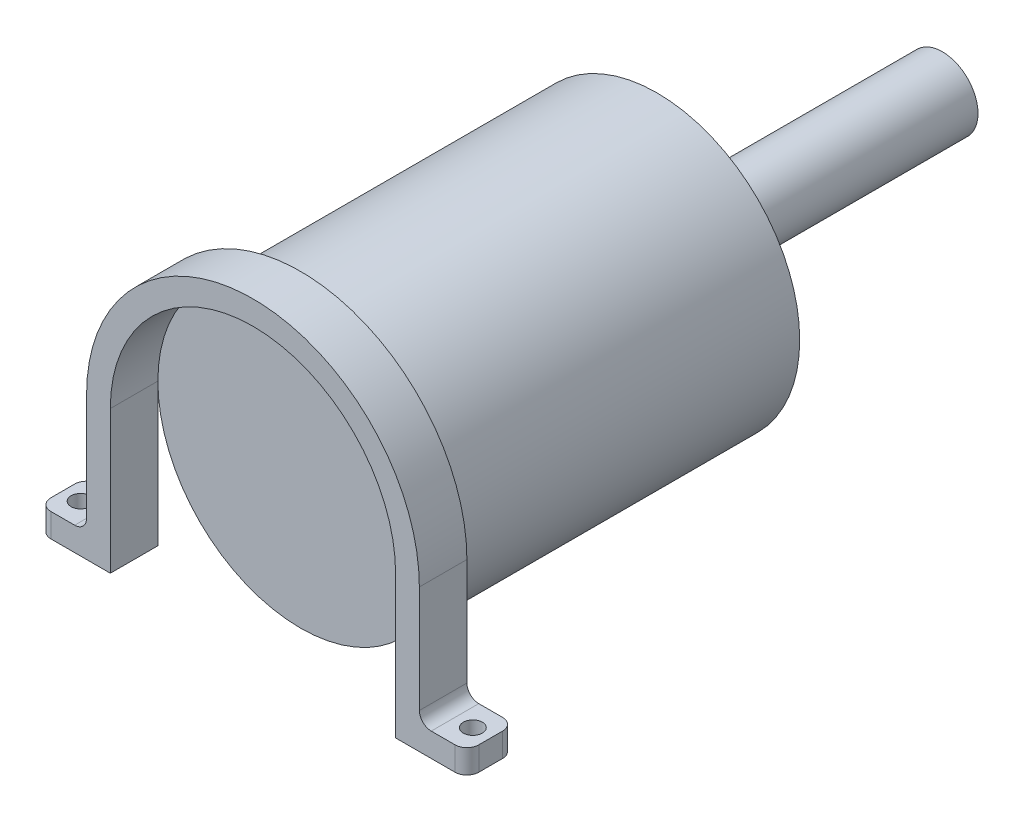
ISO-10303-21;
HEADER;
FILE_DESCRIPTION(('STEP AP214'),'2;1');
FILE_NAME('part.step','',(''),(''),'','','');
FILE_SCHEMA(('AUTOMOTIVE_DESIGN { 1 0 10303 214 1 1 1 1 }'));
ENDSEC;
DATA;
#1=APPLICATION_CONTEXT('core data for automotive mechanical design processes');
#2=APPLICATION_PROTOCOL_DEFINITION('international standard','automotive_design',2000,#1);
#3=PRODUCT_CONTEXT('',#1,'mechanical');
#4=PRODUCT('Part','Part','',(#3));
#5=PRODUCT_RELATED_PRODUCT_CATEGORY('part','',(#4));
#6=PRODUCT_DEFINITION_FORMATION('','',#4);
#7=PRODUCT_DEFINITION_CONTEXT('part definition',#1,'design');
#8=PRODUCT_DEFINITION('design','',#6,#7);
#9=PRODUCT_DEFINITION_SHAPE('','',#8);
#10=(LENGTH_UNIT() NAMED_UNIT(*) SI_UNIT(.MILLI.,.METRE.));
#11=(NAMED_UNIT(*) PLANE_ANGLE_UNIT() SI_UNIT($,.RADIAN.));
#12=(NAMED_UNIT(*) SI_UNIT($,.STERADIAN.) SOLID_ANGLE_UNIT());
#13=UNCERTAINTY_MEASURE_WITH_UNIT(LENGTH_MEASURE(1.E-05),#10,'distance_accuracy_value','');
#14=(GEOMETRIC_REPRESENTATION_CONTEXT(3) GLOBAL_UNCERTAINTY_ASSIGNED_CONTEXT((#13)) GLOBAL_UNIT_ASSIGNED_CONTEXT((#10,
#11,#12)) REPRESENTATION_CONTEXT('',''));
#15=CARTESIAN_POINT('',(0.,0.,0.));
#16=DIRECTION('',(0.,0.,1.));
#17=DIRECTION('',(1.,0.,0.));
#18=AXIS2_PLACEMENT_3D('',#15,#16,#17);
#19=CARTESIAN_POINT('',(899.999999999991,-500.000000000387,2900.));
#20=DIRECTION('',(-1.,0.,0.));
#21=DIRECTION('',(0.,0.,1.));
#22=AXIS2_PLACEMENT_3D('',#19,#20,#21);
#23=PLANE('',#22);
#24=DIRECTION('',(0.,0.,-1.));
#25=VECTOR('',#24,1.);
#26=CARTESIAN_POINT('',(899.999999999991,-600.000000000387,2900.));
#27=LINE('',#26,#25);
#28=CARTESIAN_POINT('',(899.999999999991,-600.000000000387,2850.));
#29=VERTEX_POINT('',#28);
#30=CARTESIAN_POINT('',(899.999999999991,-600.000000000387,2750.));
#31=VERTEX_POINT('',#30);
#32=EDGE_CURVE('E222',#29,#31,#27,.T.);
#33=ORIENTED_EDGE('',*,*,#32,.T.);
#34=DIRECTION('',(0.,1.,0.));
#35=VECTOR('',#34,1.);
#36=CARTESIAN_POINT('',(899.999999999991,-500.000000000387,2750.));
#37=LINE('',#36,#35);
#38=CARTESIAN_POINT('',(899.999999999991,-500.000000000387,2750.));
#39=VERTEX_POINT('',#38);
#40=EDGE_CURVE('E282',#31,#39,#37,.T.);
#41=ORIENTED_EDGE('',*,*,#40,.T.);
#42=DIRECTION('',(0.,0.,-1.));
#43=VECTOR('',#42,1.);
#44=CARTESIAN_POINT('',(899.999999999991,-500.000000000387,2900.));
#45=LINE('',#44,#43);
#46=CARTESIAN_POINT('',(899.999999999991,-500.000000000387,2850.));
#47=VERTEX_POINT('',#46);
#48=EDGE_CURVE('E192',#47,#39,#45,.T.);
#49=ORIENTED_EDGE('',*,*,#48,.F.);
#50=DIRECTION('',(0.,1.,0.));
#51=VECTOR('',#50,1.);
#52=CARTESIAN_POINT('',(899.999999999991,-600.000000000387,2850.));
#53=LINE('',#52,#51);
#54=EDGE_CURVE('E280',#47,#29,#53,.F.);
#55=ORIENTED_EDGE('',*,*,#54,.T.);
#56=EDGE_LOOP('',(#33,#41,#49,#55));
#57=FACE_BOUND('',#56,.T.);
#58=ADVANCED_FACE('F47',(#57),#23,.F.);
#59=CARTESIAN_POINT('',(750.,-500.000000000387,2900.));
#60=DIRECTION('',(0.,-1.,0.));
#61=DIRECTION('',(0.,0.,-1.));
#62=AXIS2_PLACEMENT_3D('',#59,#60,#61);
#63=PLANE('',#62);
#64=CARTESIAN_POINT('',(825.000000000005,-500.000000000387,2800.));
#65=DIRECTION('',(0.,-1.,0.));
#66=DIRECTION('',(0.,0.,1.));
#67=AXIS2_PLACEMENT_3D('',#64,#65,#66);
#68=CIRCLE('',#67,40.);
#69=CARTESIAN_POINT('',(825.000000000005,-500.000000000387,2840.));
#70=VERTEX_POINT('',#69);
#71=EDGE_CURVE('E567',#70,#70,#68,.T.);
#72=ORIENTED_EDGE('',*,*,#71,.T.);
#73=EDGE_LOOP('',(#72));
#74=FACE_BOUND('',#73,.T.);
#75=ORIENTED_EDGE('',*,*,#48,.T.);
#76=CARTESIAN_POINT('',(849.999999999991,-500.000000000387,2750.));
#77=DIRECTION('',(0.,-1.,0.));
#78=DIRECTION('',(0.,0.,-1.));
#79=AXIS2_PLACEMENT_3D('',#76,#77,#78);
#80=CIRCLE('',#79,50.);
#81=CARTESIAN_POINT('',(849.999999999991,-500.000000000387,2700.));
#82=VERTEX_POINT('',#81);
#83=EDGE_CURVE('E287',#39,#82,#80,.F.);
#84=ORIENTED_EDGE('',*,*,#83,.T.);
#85=DIRECTION('',(-1.,0.,0.));
#86=VECTOR('',#85,1.);
#87=CARTESIAN_POINT('',(750.,-500.000000000387,2700.));
#88=LINE('',#87,#86);
#89=CARTESIAN_POINT('',(750.,-500.000000000387,2700.));
#90=VERTEX_POINT('',#89);
#91=EDGE_CURVE('E189',#82,#90,#88,.T.);
#92=ORIENTED_EDGE('',*,*,#91,.T.);
#93=DIRECTION('',(0.,0.,-1.));
#94=VECTOR('',#93,1.);
#95=CARTESIAN_POINT('',(750.,-500.000000000387,2900.));
#96=LINE('',#95,#94);
#97=CARTESIAN_POINT('',(750.,-500.000000000387,2900.));
#98=VERTEX_POINT('',#97);
#99=EDGE_CURVE('E185',#98,#90,#96,.T.);
#100=ORIENTED_EDGE('',*,*,#99,.F.);
#101=DIRECTION('',(-1.,0.,0.));
#102=VECTOR('',#101,1.);
#103=CARTESIAN_POINT('',(750.,-500.000000000387,2900.));
#104=LINE('',#103,#102);
#105=CARTESIAN_POINT('',(849.999999999991,-500.000000000387,2900.));
#106=VERTEX_POINT('',#105);
#107=EDGE_CURVE('E172',#106,#98,#104,.T.);
#108=ORIENTED_EDGE('',*,*,#107,.F.);
#109=CARTESIAN_POINT('',(849.999999999991,-500.000000000387,2850.));
#110=DIRECTION('',(0.,-1.,0.));
#111=DIRECTION('',(0.,0.,-1.));
#112=AXIS2_PLACEMENT_3D('',#109,#110,#111);
#113=CIRCLE('',#112,50.);
#114=EDGE_CURVE('E285',#106,#47,#113,.F.);
#115=ORIENTED_EDGE('',*,*,#114,.T.);
#116=EDGE_LOOP('',(#75,#84,#92,#100,#108,#115));
#117=FACE_BOUND('',#116,.T.);
#118=ADVANCED_FACE('F187',(#74,#117),#63,.F.);
#119=CARTESIAN_POINT('',(750.,-450.000000000387,2900.));
#120=DIRECTION('',(0.,0.,-1.));
#121=DIRECTION('',(-1.,0.,0.));
#122=AXIS2_PLACEMENT_3D('',#119,#120,#121);
#123=CYLINDRICAL_SURFACE('',#122,50.);
#124=CARTESIAN_POINT('',(750.,-450.000000000387,2700.));
#125=DIRECTION('',(0.,0.,-1.));
#126=DIRECTION('',(-1.,0.,0.));
#127=AXIS2_PLACEMENT_3D('',#124,#125,#126);
#128=CIRCLE('',#127,50.);
#129=CARTESIAN_POINT('',(700.,-450.000000000387,2700.));
#130=VERTEX_POINT('',#129);
#131=EDGE_CURVE('E224',#90,#130,#128,.T.);
#132=ORIENTED_EDGE('',*,*,#131,.T.);
#133=DIRECTION('',(0.,0.,-1.));
#134=VECTOR('',#133,1.);
#135=CARTESIAN_POINT('',(700.,-450.000000000387,2900.));
#136=LINE('',#135,#134);
#137=CARTESIAN_POINT('',(700.,-450.000000000387,2900.));
#138=VERTEX_POINT('',#137);
#139=EDGE_CURVE('E193',#138,#130,#136,.T.);
#140=ORIENTED_EDGE('',*,*,#139,.F.);
#141=CARTESIAN_POINT('',(750.,-450.000000000387,2900.));
#142=DIRECTION('',(0.,0.,-1.));
#143=DIRECTION('',(-1.,0.,0.));
#144=AXIS2_PLACEMENT_3D('',#141,#142,#143);
#145=CIRCLE('',#144,50.);
#146=EDGE_CURVE('E177',#98,#138,#145,.T.);
#147=ORIENTED_EDGE('',*,*,#146,.F.);
#148=ORIENTED_EDGE('',*,*,#99,.T.);
#149=EDGE_LOOP('',(#132,#140,#147,#148));
#150=FACE_BOUND('',#149,.T.);
#151=ADVANCED_FACE('F195',(#150),#123,.F.);
#152=CARTESIAN_POINT('',(700.,2.21802997291814E-13,2900.));
#153=DIRECTION('',(-1.,0.,0.));
#154=DIRECTION('',(0.,0.,1.));
#155=AXIS2_PLACEMENT_3D('',#152,#153,#154);
#156=PLANE('',#155);
#157=DIRECTION('',(0.,1.,0.));
#158=VECTOR('',#157,1.);
#159=CARTESIAN_POINT('',(700.,2.21802997291814E-13,2700.));
#160=LINE('',#159,#158);
#161=CARTESIAN_POINT('',(700.,2.21802997291814E-13,2700.));
#162=VERTEX_POINT('',#161);
#163=EDGE_CURVE('E227',#130,#162,#160,.T.);
#164=ORIENTED_EDGE('',*,*,#163,.T.);
#165=DIRECTION('',(0.,0.,-1.));
#166=VECTOR('',#165,1.);
#167=CARTESIAN_POINT('',(700.,2.21802997291814E-13,2900.));
#168=LINE('',#167,#166);
#169=CARTESIAN_POINT('',(700.,2.21802997291814E-13,2900.));
#170=VERTEX_POINT('',#169);
#171=EDGE_CURVE('E275',#170,#162,#168,.T.);
#172=ORIENTED_EDGE('',*,*,#171,.F.);
#173=DIRECTION('',(0.,1.,0.));
#174=VECTOR('',#173,1.);
#175=CARTESIAN_POINT('',(700.,2.21802997291814E-13,2900.));
#176=LINE('',#175,#174);
#177=EDGE_CURVE('E198',#138,#170,#176,.T.);
#178=ORIENTED_EDGE('',*,*,#177,.F.);
#179=ORIENTED_EDGE('',*,*,#139,.T.);
#180=EDGE_LOOP('',(#164,#172,#178,#179));
#181=FACE_BOUND('',#180,.T.);
#182=ADVANCED_FACE('F362',(#181),#156,.F.);
#183=CARTESIAN_POINT('',(0.,0.,2900.));
#184=DIRECTION('',(0.,0.,-1.));
#185=DIRECTION('',(-1.,0.,0.));
#186=AXIS2_PLACEMENT_3D('',#183,#184,#185);
#187=CYLINDRICAL_SURFACE('',#186,700.);
#188=CARTESIAN_POINT('',(0.,0.,2700.));
#189=DIRECTION('',(0.,0.,1.));
#190=DIRECTION('',(1.,0.,0.));
#191=AXIS2_PLACEMENT_3D('',#188,#189,#190);
#192=CIRCLE('',#191,700.);
#193=CARTESIAN_POINT('',(-700.,-2.25137170954729E-13,2700.));
#194=VERTEX_POINT('',#193);
#195=EDGE_CURVE('E229',#162,#194,#192,.T.);
#196=ORIENTED_EDGE('',*,*,#195,.T.);
#197=DIRECTION('',(0.,0.,-1.));
#198=VECTOR('',#197,1.);
#199=CARTESIAN_POINT('',(-700.,-2.25137170954729E-13,2900.));
#200=LINE('',#199,#198);
#201=CARTESIAN_POINT('',(-700.,-2.25137170954729E-13,2900.));
#202=VERTEX_POINT('',#201);
#203=EDGE_CURVE('E272',#202,#194,#200,.T.);
#204=ORIENTED_EDGE('',*,*,#203,.F.);
#205=CARTESIAN_POINT('',(0.,0.,2900.));
#206=DIRECTION('',(0.,0.,1.));
#207=DIRECTION('',(1.,0.,0.));
#208=AXIS2_PLACEMENT_3D('',#205,#206,#207);
#209=CIRCLE('',#208,700.);
#210=EDGE_CURVE('E200',#170,#202,#209,.T.);
#211=ORIENTED_EDGE('',*,*,#210,.F.);
#212=ORIENTED_EDGE('',*,*,#171,.T.);
#213=EDGE_LOOP('',(#196,#204,#211,#212));
#214=FACE_BOUND('',#213,.T.);
#215=ADVANCED_FACE('F369',(#214),#187,.T.);
#216=CARTESIAN_POINT('',(-700.,-2.25137170954729E-13,2900.));
#217=DIRECTION('',(1.,0.,0.));
#218=DIRECTION('',(0.,1.,0.));
#219=AXIS2_PLACEMENT_3D('',#216,#217,#218);
#220=PLANE('',#219);
#221=DIRECTION('',(0.,-1.,0.));
#222=VECTOR('',#221,1.);
#223=CARTESIAN_POINT('',(-700.,-2.25137170954729E-13,2700.));
#224=LINE('',#223,#222);
#225=CARTESIAN_POINT('',(-700.,-450.000000000387,2700.));
#226=VERTEX_POINT('',#225);
#227=EDGE_CURVE('E231',#194,#226,#224,.T.);
#228=ORIENTED_EDGE('',*,*,#227,.T.);
#229=DIRECTION('',(0.,0.,-1.));
#230=VECTOR('',#229,1.);
#231=CARTESIAN_POINT('',(-700.,-450.000000000387,2900.));
#232=LINE('',#231,#230);
#233=CARTESIAN_POINT('',(-700.,-450.000000000387,2900.));
#234=VERTEX_POINT('',#233);
#235=EDGE_CURVE('E269',#234,#226,#232,.T.);
#236=ORIENTED_EDGE('',*,*,#235,.F.);
#237=DIRECTION('',(0.,-1.,0.));
#238=VECTOR('',#237,1.);
#239=CARTESIAN_POINT('',(-700.,-2.25137170954729E-13,2900.));
#240=LINE('',#239,#238);
#241=EDGE_CURVE('E205',#202,#234,#240,.T.);
#242=ORIENTED_EDGE('',*,*,#241,.F.);
#243=ORIENTED_EDGE('',*,*,#203,.T.);
#244=EDGE_LOOP('',(#228,#236,#242,#243));
#245=FACE_BOUND('',#244,.T.);
#246=ADVANCED_FACE('F372',(#245),#220,.F.);
#247=CARTESIAN_POINT('',(-750.,-450.000000000387,2900.));
#248=DIRECTION('',(0.,0.,-1.));
#249=DIRECTION('',(-1.,0.,0.));
#250=AXIS2_PLACEMENT_3D('',#247,#248,#249);
#251=CYLINDRICAL_SURFACE('',#250,50.);
#252=CARTESIAN_POINT('',(-750.,-450.000000000387,2700.));
#253=DIRECTION('',(0.,0.,-1.));
#254=DIRECTION('',(1.,0.,0.));
#255=AXIS2_PLACEMENT_3D('',#252,#253,#254);
#256=CIRCLE('',#255,50.);
#257=CARTESIAN_POINT('',(-750.,-500.000000000387,2700.));
#258=VERTEX_POINT('',#257);
#259=EDGE_CURVE('E233',#226,#258,#256,.T.);
#260=ORIENTED_EDGE('',*,*,#259,.T.);
#261=DIRECTION('',(0.,0.,-1.));
#262=VECTOR('',#261,1.);
#263=CARTESIAN_POINT('',(-750.,-500.000000000387,2900.));
#264=LINE('',#263,#262);
#265=CARTESIAN_POINT('',(-750.,-500.000000000387,2900.));
#266=VERTEX_POINT('',#265);
#267=EDGE_CURVE('E266',#266,#258,#264,.T.);
#268=ORIENTED_EDGE('',*,*,#267,.F.);
#269=CARTESIAN_POINT('',(-750.,-450.000000000387,2900.));
#270=DIRECTION('',(0.,0.,-1.));
#271=DIRECTION('',(1.,0.,0.));
#272=AXIS2_PLACEMENT_3D('',#269,#270,#271);
#273=CIRCLE('',#272,50.);
#274=EDGE_CURVE('E207',#234,#266,#273,.T.);
#275=ORIENTED_EDGE('',*,*,#274,.F.);
#276=ORIENTED_EDGE('',*,*,#235,.T.);
#277=EDGE_LOOP('',(#260,#268,#275,#276));
#278=FACE_BOUND('',#277,.T.);
#279=ADVANCED_FACE('F375',(#278),#251,.F.);
#280=CARTESIAN_POINT('',(-750.,-500.000000000387,2900.));
#281=DIRECTION('',(0.,-1.,0.));
#282=DIRECTION('',(0.,0.,-1.));
#283=AXIS2_PLACEMENT_3D('',#280,#281,#282);
#284=PLANE('',#283);
#285=CARTESIAN_POINT('',(-825.000000000005,-500.000000000387,2800.));
#286=DIRECTION('',(0.,1.,0.));
#287=DIRECTION('',(0.,0.,1.));
#288=AXIS2_PLACEMENT_3D('',#285,#286,#287);
#289=CIRCLE('',#288,40.);
#290=CARTESIAN_POINT('',(-825.000000000005,-500.000000000387,2840.));
#291=VERTEX_POINT('',#290);
#292=EDGE_CURVE('E563',#291,#291,#289,.T.);
#293=ORIENTED_EDGE('',*,*,#292,.F.);
#294=EDGE_LOOP('',(#293));
#295=FACE_BOUND('',#294,.T.);
#296=DIRECTION('',(-1.,0.,0.));
#297=VECTOR('',#296,1.);
#298=CARTESIAN_POINT('',(-750.,-500.000000000387,2700.));
#299=LINE('',#298,#297);
#300=CARTESIAN_POINT('',(-850.000000000009,-500.000000000387,2700.));
#301=VERTEX_POINT('',#300);
#302=EDGE_CURVE('E235',#258,#301,#299,.T.);
#303=ORIENTED_EDGE('',*,*,#302,.T.);
#304=CARTESIAN_POINT('',(-850.000000000009,-500.000000000387,2750.));
#305=DIRECTION('',(0.,-1.,0.));
#306=DIRECTION('',(0.,0.,-1.));
#307=AXIS2_PLACEMENT_3D('',#304,#305,#306);
#308=CIRCLE('',#307,50.);
#309=CARTESIAN_POINT('',(-900.000000000009,-500.000000000387,2750.));
#310=VERTEX_POINT('',#309);
#311=EDGE_CURVE('E12',#301,#310,#308,.F.);
#312=ORIENTED_EDGE('',*,*,#311,.T.);
#313=DIRECTION('',(0.,0.,-1.));
#314=VECTOR('',#313,1.);
#315=CARTESIAN_POINT('',(-900.000000000009,-500.000000000387,2900.));
#316=LINE('',#315,#314);
#317=CARTESIAN_POINT('',(-900.000000000009,-500.000000000387,2850.));
#318=VERTEX_POINT('',#317);
#319=EDGE_CURVE('E264',#318,#310,#316,.T.);
#320=ORIENTED_EDGE('',*,*,#319,.F.);
#321=CARTESIAN_POINT('',(-850.000000000009,-500.000000000387,2850.));
#322=DIRECTION('',(0.,-1.,0.));
#323=DIRECTION('',(0.,0.,-1.));
#324=AXIS2_PLACEMENT_3D('',#321,#322,#323);
#325=CIRCLE('',#324,50.);
#326=CARTESIAN_POINT('',(-850.000000000009,-500.000000000387,2900.));
#327=VERTEX_POINT('',#326);
#328=EDGE_CURVE('E55',#318,#327,#325,.F.);
#329=ORIENTED_EDGE('',*,*,#328,.T.);
#330=DIRECTION('',(-1.,0.,0.));
#331=VECTOR('',#330,1.);
#332=CARTESIAN_POINT('',(-750.,-500.000000000387,2900.));
#333=LINE('',#332,#331);
#334=EDGE_CURVE('E209',#266,#327,#333,.T.);
#335=ORIENTED_EDGE('',*,*,#334,.F.);
#336=ORIENTED_EDGE('',*,*,#267,.T.);
#337=EDGE_LOOP('',(#303,#312,#320,#329,#335,#336));
#338=FACE_BOUND('',#337,.T.);
#339=ADVANCED_FACE('F310',(#295,#338),#284,.F.);
#340=CARTESIAN_POINT('',(-900.000000000009,-500.000000000387,2900.));
#341=DIRECTION('',(1.,0.,0.));
#342=DIRECTION('',(0.,0.,-1.));
#343=AXIS2_PLACEMENT_3D('',#340,#341,#342);
#344=PLANE('',#343);
#345=ORIENTED_EDGE('',*,*,#319,.T.);
#346=DIRECTION('',(0.,-1.,0.));
#347=VECTOR('',#346,1.);
#348=CARTESIAN_POINT('',(-900.000000000009,-500.000000000387,2750.));
#349=LINE('',#348,#347);
#350=CARTESIAN_POINT('',(-900.000000000009,-600.000000000387,2750.));
#351=VERTEX_POINT('',#350);
#352=EDGE_CURVE('E302',#310,#351,#349,.T.);
#353=ORIENTED_EDGE('',*,*,#352,.T.);
#354=DIRECTION('',(0.,0.,-1.));
#355=VECTOR('',#354,1.);
#356=CARTESIAN_POINT('',(-900.000000000009,-600.000000000387,2900.));
#357=LINE('',#356,#355);
#358=CARTESIAN_POINT('',(-900.000000000009,-600.000000000387,2850.));
#359=VERTEX_POINT('',#358);
#360=EDGE_CURVE('E261',#359,#351,#357,.T.);
#361=ORIENTED_EDGE('',*,*,#360,.F.);
#362=DIRECTION('',(0.,-1.,0.));
#363=VECTOR('',#362,1.);
#364=CARTESIAN_POINT('',(-900.000000000009,-500.000000000387,2850.));
#365=LINE('',#364,#363);
#366=EDGE_CURVE('E67',#359,#318,#365,.F.);
#367=ORIENTED_EDGE('',*,*,#366,.T.);
#368=EDGE_LOOP('',(#345,#353,#361,#367));
#369=FACE_BOUND('',#368,.T.);
#370=ADVANCED_FACE('F319',(#369),#344,.F.);
#371=CARTESIAN_POINT('',(-600.,-600.000000000387,2900.));
#372=DIRECTION('',(0.,1.,0.));
#373=DIRECTION('',(-1.,0.,0.));
#374=AXIS2_PLACEMENT_3D('',#371,#372,#373);
#375=PLANE('',#374);
#376=CARTESIAN_POINT('',(-825.000000000005,-600.000000000387,2800.));
#377=DIRECTION('',(0.,1.,0.));
#378=DIRECTION('',(0.,0.,1.));
#379=AXIS2_PLACEMENT_3D('',#376,#377,#378);
#380=CIRCLE('',#379,40.);
#381=CARTESIAN_POINT('',(-825.000000000005,-600.000000000387,2840.));
#382=VERTEX_POINT('',#381);
#383=EDGE_CURVE('E225',#382,#382,#380,.T.);
#384=ORIENTED_EDGE('',*,*,#383,.T.);
#385=EDGE_LOOP('',(#384));
#386=FACE_BOUND('',#385,.T.);
#387=ORIENTED_EDGE('',*,*,#360,.T.);
#388=CARTESIAN_POINT('',(-850.000000000009,-600.000000000387,2750.));
#389=DIRECTION('',(0.,1.,0.));
#390=DIRECTION('',(-1.,0.,0.));
#391=AXIS2_PLACEMENT_3D('',#388,#389,#390);
#392=CIRCLE('',#391,50.);
#393=CARTESIAN_POINT('',(-850.000000000009,-600.000000000387,2700.));
#394=VERTEX_POINT('',#393);
#395=EDGE_CURVE('E307',#351,#394,#392,.F.);
#396=ORIENTED_EDGE('',*,*,#395,.T.);
#397=DIRECTION('',(1.,0.,0.));
#398=VECTOR('',#397,1.);
#399=CARTESIAN_POINT('',(-600.,-600.000000000387,2700.));
#400=LINE('',#399,#398);
#401=CARTESIAN_POINT('',(-600.,-600.000000000387,2700.));
#402=VERTEX_POINT('',#401);
#403=EDGE_CURVE('E237',#394,#402,#400,.T.);
#404=ORIENTED_EDGE('',*,*,#403,.T.);
#405=DIRECTION('',(0.,0.,-1.));
#406=VECTOR('',#405,1.);
#407=CARTESIAN_POINT('',(-600.,-600.000000000387,2900.));
#408=LINE('',#407,#406);
#409=CARTESIAN_POINT('',(-600.,-600.000000000387,2900.));
#410=VERTEX_POINT('',#409);
#411=EDGE_CURVE('E258',#410,#402,#408,.T.);
#412=ORIENTED_EDGE('',*,*,#411,.F.);
#413=DIRECTION('',(1.,0.,0.));
#414=VECTOR('',#413,1.);
#415=CARTESIAN_POINT('',(-600.,-600.000000000387,2900.));
#416=LINE('',#415,#414);
#417=CARTESIAN_POINT('',(-850.000000000009,-600.000000000387,2900.));
#418=VERTEX_POINT('',#417);
#419=EDGE_CURVE('E212',#418,#410,#416,.T.);
#420=ORIENTED_EDGE('',*,*,#419,.F.);
#421=CARTESIAN_POINT('',(-850.000000000009,-600.000000000387,2850.));
#422=DIRECTION('',(0.,1.,0.));
#423=DIRECTION('',(-1.,0.,0.));
#424=AXIS2_PLACEMENT_3D('',#421,#422,#423);
#425=CIRCLE('',#424,50.);
#426=EDGE_CURVE('E305',#418,#359,#425,.F.);
#427=ORIENTED_EDGE('',*,*,#426,.T.);
#428=EDGE_LOOP('',(#387,#396,#404,#412,#420,#427));
#429=FACE_BOUND('',#428,.T.);
#430=ADVANCED_FACE('F317',(#386,#429),#375,.F.);
#431=CARTESIAN_POINT('',(-600.,-2.41586688783755E-13,2900.));
#432=DIRECTION('',(-1.,0.,0.));
#433=DIRECTION('',(0.,-1.,0.));
#434=AXIS2_PLACEMENT_3D('',#431,#432,#433);
#435=PLANE('',#434);
#436=DIRECTION('',(0.,1.,0.));
#437=VECTOR('',#436,1.);
#438=CARTESIAN_POINT('',(-600.,-2.41586688783755E-13,2700.));
#439=LINE('',#438,#437);
#440=CARTESIAN_POINT('',(-600.,-1.92974717961196E-13,2700.));
#441=VERTEX_POINT('',#440);
#442=EDGE_CURVE('E239',#402,#441,#439,.T.);
#443=ORIENTED_EDGE('',*,*,#442,.T.);
#444=DIRECTION('',(0.,0.,-1.));
#445=VECTOR('',#444,1.);
#446=CARTESIAN_POINT('',(-600.,-1.92974717961196E-13,2900.));
#447=LINE('',#446,#445);
#448=CARTESIAN_POINT('',(-600.,-1.92974717961196E-13,2900.));
#449=VERTEX_POINT('',#448);
#450=EDGE_CURVE('E255',#449,#441,#447,.T.);
#451=ORIENTED_EDGE('',*,*,#450,.F.);
#452=DIRECTION('',(0.,1.,0.));
#453=VECTOR('',#452,1.);
#454=CARTESIAN_POINT('',(-600.,-2.41586688783755E-13,2900.));
#455=LINE('',#454,#453);
#456=EDGE_CURVE('E214',#410,#449,#455,.T.);
#457=ORIENTED_EDGE('',*,*,#456,.F.);
#458=ORIENTED_EDGE('',*,*,#411,.T.);
#459=EDGE_LOOP('',(#443,#451,#457,#458));
#460=FACE_BOUND('',#459,.T.);
#461=ADVANCED_FACE('F333',(#460),#435,.F.);
#462=CARTESIAN_POINT('',(0.,0.,2900.));
#463=DIRECTION('',(0.,0.,-1.));
#464=DIRECTION('',(-1.,0.,0.));
#465=AXIS2_PLACEMENT_3D('',#462,#463,#464);
#466=CYLINDRICAL_SURFACE('',#465,600.);
#467=CARTESIAN_POINT('',(0.,0.,2700.));
#468=DIRECTION('',(0.,0.,-1.));
#469=DIRECTION('',(1.,0.,0.));
#470=AXIS2_PLACEMENT_3D('',#467,#468,#469);
#471=CIRCLE('',#470,600.);
#472=CARTESIAN_POINT('',(600.,2.21802997291814E-13,2700.));
#473=VERTEX_POINT('',#472);
#474=EDGE_CURVE('E241',#441,#473,#471,.T.);
#475=ORIENTED_EDGE('',*,*,#474,.T.);
#476=DIRECTION('',(0.,0.,-1.));
#477=VECTOR('',#476,1.);
#478=CARTESIAN_POINT('',(600.,2.21802997291814E-13,2900.));
#479=LINE('',#478,#477);
#480=CARTESIAN_POINT('',(600.,2.21802997291814E-13,2900.));
#481=VERTEX_POINT('',#480);
#482=EDGE_CURVE('E252',#481,#473,#479,.T.);
#483=ORIENTED_EDGE('',*,*,#482,.F.);
#484=CARTESIAN_POINT('',(0.,0.,2900.));
#485=DIRECTION('',(0.,0.,-1.));
#486=DIRECTION('',(1.,0.,0.));
#487=AXIS2_PLACEMENT_3D('',#484,#485,#486);
#488=CIRCLE('',#487,600.);
#489=EDGE_CURVE('E216',#449,#481,#488,.T.);
#490=ORIENTED_EDGE('',*,*,#489,.F.);
#491=ORIENTED_EDGE('',*,*,#450,.T.);
#492=EDGE_LOOP('',(#475,#483,#490,#491));
#493=FACE_BOUND('',#492,.T.);
#494=ADVANCED_FACE('F337',(#493),#466,.F.);
#495=CARTESIAN_POINT('',(600.,2.21802997291814E-13,2900.));
#496=DIRECTION('',(1.,0.,0.));
#497=DIRECTION('',(0.,1.,0.));
#498=AXIS2_PLACEMENT_3D('',#495,#496,#497);
#499=PLANE('',#498);
#500=DIRECTION('',(0.,-1.,0.));
#501=VECTOR('',#500,1.);
#502=CARTESIAN_POINT('',(600.,2.21802997291814E-13,2700.));
#503=LINE('',#502,#501);
#504=CARTESIAN_POINT('',(600.,-600.000000000387,2700.));
#505=VERTEX_POINT('',#504);
#506=EDGE_CURVE('E243',#473,#505,#503,.T.);
#507=ORIENTED_EDGE('',*,*,#506,.T.);
#508=DIRECTION('',(0.,0.,-1.));
#509=VECTOR('',#508,1.);
#510=CARTESIAN_POINT('',(600.,-600.000000000387,2900.));
#511=LINE('',#510,#509);
#512=CARTESIAN_POINT('',(600.,-600.000000000387,2900.));
#513=VERTEX_POINT('',#512);
#514=EDGE_CURVE('E249',#513,#505,#511,.T.);
#515=ORIENTED_EDGE('',*,*,#514,.F.);
#516=DIRECTION('',(0.,-1.,0.));
#517=VECTOR('',#516,1.);
#518=CARTESIAN_POINT('',(600.,2.21802997291814E-13,2900.));
#519=LINE('',#518,#517);
#520=EDGE_CURVE('E218',#481,#513,#519,.T.);
#521=ORIENTED_EDGE('',*,*,#520,.F.);
#522=ORIENTED_EDGE('',*,*,#482,.T.);
#523=EDGE_LOOP('',(#507,#515,#521,#522));
#524=FACE_BOUND('',#523,.T.);
#525=ADVANCED_FACE('F343',(#524),#499,.F.);
#526=CARTESIAN_POINT('',(600.,-600.000000000387,2900.));
#527=DIRECTION('',(0.,1.,0.));
#528=DIRECTION('',(0.,0.,1.));
#529=AXIS2_PLACEMENT_3D('',#526,#527,#528);
#530=PLANE('',#529);
#531=CARTESIAN_POINT('',(825.000000000005,-600.000000000387,2800.));
#532=DIRECTION('',(0.,-1.,0.));
#533=DIRECTION('',(0.,0.,1.));
#534=AXIS2_PLACEMENT_3D('',#531,#532,#533);
#535=CIRCLE('',#534,40.);
#536=CARTESIAN_POINT('',(825.000000000005,-600.000000000387,2840.));
#537=VERTEX_POINT('',#536);
#538=EDGE_CURVE('E564',#537,#537,#535,.T.);
#539=ORIENTED_EDGE('',*,*,#538,.F.);
#540=EDGE_LOOP('',(#539));
#541=FACE_BOUND('',#540,.T.);
#542=DIRECTION('',(1.,0.,0.));
#543=VECTOR('',#542,1.);
#544=CARTESIAN_POINT('',(600.,-600.000000000387,2700.));
#545=LINE('',#544,#543);
#546=CARTESIAN_POINT('',(849.999999999991,-600.000000000387,2700.));
#547=VERTEX_POINT('',#546);
#548=EDGE_CURVE('E182',#505,#547,#545,.T.);
#549=ORIENTED_EDGE('',*,*,#548,.T.);
#550=CARTESIAN_POINT('',(849.999999999991,-600.000000000387,2750.));
#551=DIRECTION('',(0.,1.,0.));
#552=DIRECTION('',(0.,0.,1.));
#553=AXIS2_PLACEMENT_3D('',#550,#551,#552);
#554=CIRCLE('',#553,50.);
#555=EDGE_CURVE('E295',#547,#31,#554,.F.);
#556=ORIENTED_EDGE('',*,*,#555,.T.);
#557=ORIENTED_EDGE('',*,*,#32,.F.);
#558=CARTESIAN_POINT('',(849.999999999991,-600.000000000387,2850.));
#559=DIRECTION('',(0.,1.,0.));
#560=DIRECTION('',(0.,0.,1.));
#561=AXIS2_PLACEMENT_3D('',#558,#559,#560);
#562=CIRCLE('',#561,50.);
#563=CARTESIAN_POINT('',(849.999999999991,-600.000000000387,2900.));
#564=VERTEX_POINT('',#563);
#565=EDGE_CURVE('E293',#29,#564,#562,.F.);
#566=ORIENTED_EDGE('',*,*,#565,.T.);
#567=DIRECTION('',(1.,0.,0.));
#568=VECTOR('',#567,1.);
#569=CARTESIAN_POINT('',(600.,-600.000000000387,2900.));
#570=LINE('',#569,#568);
#571=EDGE_CURVE('E220',#513,#564,#570,.T.);
#572=ORIENTED_EDGE('',*,*,#571,.F.);
#573=ORIENTED_EDGE('',*,*,#514,.T.);
#574=EDGE_LOOP('',(#549,#556,#557,#566,#572,#573));
#575=FACE_BOUND('',#574,.T.);
#576=ADVANCED_FACE('F346',(#541,#575),#530,.F.);
#577=CARTESIAN_POINT('',(0.,0.,2900.));
#578=DIRECTION('',(0.,0.,1.));
#579=DIRECTION('',(1.,0.,0.));
#580=AXIS2_PLACEMENT_3D('',#577,#578,#579);
#581=PLANE('',#580);
#582=ORIENTED_EDGE('',*,*,#571,.T.);
#583=DIRECTION('',(0.,1.,0.));
#584=VECTOR('',#583,1.);
#585=CARTESIAN_POINT('',(849.999999999991,-500.000000000387,2900.));
#586=LINE('',#585,#584);
#587=EDGE_CURVE('E180',#564,#106,#586,.T.);
#588=ORIENTED_EDGE('',*,*,#587,.T.);
#589=ORIENTED_EDGE('',*,*,#107,.T.);
#590=ORIENTED_EDGE('',*,*,#146,.T.);
#591=ORIENTED_EDGE('',*,*,#177,.T.);
#592=ORIENTED_EDGE('',*,*,#210,.T.);
#593=ORIENTED_EDGE('',*,*,#241,.T.);
#594=ORIENTED_EDGE('',*,*,#274,.T.);
#595=ORIENTED_EDGE('',*,*,#334,.T.);
#596=DIRECTION('',(0.,-1.,0.));
#597=VECTOR('',#596,1.);
#598=CARTESIAN_POINT('',(-850.000000000009,-600.000000000387,2900.));
#599=LINE('',#598,#597);
#600=EDGE_CURVE('E297',#327,#418,#599,.T.);
#601=ORIENTED_EDGE('',*,*,#600,.T.);
#602=ORIENTED_EDGE('',*,*,#419,.T.);
#603=ORIENTED_EDGE('',*,*,#456,.T.);
#604=ORIENTED_EDGE('',*,*,#489,.T.);
#605=ORIENTED_EDGE('',*,*,#520,.T.);
#606=EDGE_LOOP('',(#582,#588,#589,#590,#591,#592,#593,#594,#595,#601,#602,#603,#604,#605));
#607=FACE_BOUND('',#606,.T.);
#608=ADVANCED_FACE('F175',(#607),#581,.T.);
#609=CARTESIAN_POINT('',(0.,0.,2700.));
#610=DIRECTION('',(0.,0.,1.));
#611=DIRECTION('',(1.,0.,0.));
#612=AXIS2_PLACEMENT_3D('',#609,#610,#611);
#613=PLANE('',#612);
#614=ORIENTED_EDGE('',*,*,#91,.F.);
#615=DIRECTION('',(0.,1.,0.));
#616=VECTOR('',#615,1.);
#617=CARTESIAN_POINT('',(849.999999999991,0.,2700.));
#618=LINE('',#617,#616);
#619=EDGE_CURVE('E291',#82,#547,#618,.F.);
#620=ORIENTED_EDGE('',*,*,#619,.T.);
#621=ORIENTED_EDGE('',*,*,#548,.F.);
#622=ORIENTED_EDGE('',*,*,#506,.F.);
#623=ORIENTED_EDGE('',*,*,#474,.F.);
#624=ORIENTED_EDGE('',*,*,#442,.F.);
#625=ORIENTED_EDGE('',*,*,#403,.F.);
#626=DIRECTION('',(0.,-1.,0.));
#627=VECTOR('',#626,1.);
#628=CARTESIAN_POINT('',(-850.000000000009,0.,2700.));
#629=LINE('',#628,#627);
#630=EDGE_CURVE('E289',#394,#301,#629,.F.);
#631=ORIENTED_EDGE('',*,*,#630,.T.);
#632=ORIENTED_EDGE('',*,*,#302,.F.);
#633=ORIENTED_EDGE('',*,*,#259,.F.);
#634=ORIENTED_EDGE('',*,*,#227,.F.);
#635=ORIENTED_EDGE('',*,*,#195,.F.);
#636=ORIENTED_EDGE('',*,*,#163,.F.);
#637=ORIENTED_EDGE('',*,*,#131,.F.);
#638=EDGE_LOOP('',(#614,#620,#621,#622,#623,#624,#625,#631,#632,#633,#634,#635,#636,#637));
#639=FACE_BOUND('',#638,.T.);
#640=ADVANCED_FACE('F327',(#639),#613,.F.);
#641=CARTESIAN_POINT('',(-825.000000000005,-600.000000000387,2800.));
#642=DIRECTION('',(0.,1.,0.));
#643=DIRECTION('',(0.,0.,1.));
#644=AXIS2_PLACEMENT_3D('',#641,#642,#643);
#645=CYLINDRICAL_SURFACE('',#644,40.);
#646=ORIENTED_EDGE('',*,*,#383,.F.);
#647=EDGE_LOOP('',(#646));
#648=FACE_BOUND('',#647,.T.);
#649=ORIENTED_EDGE('',*,*,#292,.T.);
#650=EDGE_LOOP('',(#649));
#651=FACE_BOUND('',#650,.T.);
#652=ADVANCED_FACE('F431',(#648,#651),#645,.F.);
#653=CARTESIAN_POINT('',(825.000000000005,-600.000000000387,2800.));
#654=DIRECTION('',(0.,1.,0.));
#655=DIRECTION('',(0.,0.,1.));
#656=AXIS2_PLACEMENT_3D('',#653,#654,#655);
#657=CYLINDRICAL_SURFACE('',#656,40.);
#658=ORIENTED_EDGE('',*,*,#538,.T.);
#659=EDGE_LOOP('',(#658));
#660=FACE_BOUND('',#659,.T.);
#661=ORIENTED_EDGE('',*,*,#71,.F.);
#662=EDGE_LOOP('',(#661));
#663=FACE_BOUND('',#662,.T.);
#664=ADVANCED_FACE('F396',(#660,#663),#657,.F.);
#665=CARTESIAN_POINT('',(849.999999999991,-500.000000000387,2750.));
#666=DIRECTION('',(0.,1.,0.));
#667=DIRECTION('',(0.,0.,1.));
#668=AXIS2_PLACEMENT_3D('',#665,#666,#667);
#669=CYLINDRICAL_SURFACE('',#668,50.);
#670=ORIENTED_EDGE('',*,*,#555,.F.);
#671=ORIENTED_EDGE('',*,*,#619,.F.);
#672=ORIENTED_EDGE('',*,*,#83,.F.);
#673=ORIENTED_EDGE('',*,*,#40,.F.);
#674=EDGE_LOOP('',(#670,#671,#672,#673));
#675=FACE_BOUND('',#674,.T.);
#676=ADVANCED_FACE('F357',(#675),#669,.T.);
#677=CARTESIAN_POINT('',(849.999999999991,0.,2850.));
#678=DIRECTION('',(0.,-1.,0.));
#679=DIRECTION('',(0.,0.,-1.));
#680=AXIS2_PLACEMENT_3D('',#677,#678,#679);
#681=CYLINDRICAL_SURFACE('',#680,50.);
#682=ORIENTED_EDGE('',*,*,#565,.F.);
#683=ORIENTED_EDGE('',*,*,#54,.F.);
#684=ORIENTED_EDGE('',*,*,#114,.F.);
#685=ORIENTED_EDGE('',*,*,#587,.F.);
#686=EDGE_LOOP('',(#682,#683,#684,#685));
#687=FACE_BOUND('',#686,.T.);
#688=ADVANCED_FACE('F351',(#687),#681,.T.);
#689=CARTESIAN_POINT('',(-850.000000000009,-500.000000000387,2750.));
#690=DIRECTION('',(0.,-1.,0.));
#691=DIRECTION('',(0.,0.,-1.));
#692=AXIS2_PLACEMENT_3D('',#689,#690,#691);
#693=CYLINDRICAL_SURFACE('',#692,50.);
#694=ORIENTED_EDGE('',*,*,#311,.F.);
#695=ORIENTED_EDGE('',*,*,#630,.F.);
#696=ORIENTED_EDGE('',*,*,#395,.F.);
#697=ORIENTED_EDGE('',*,*,#352,.F.);
#698=EDGE_LOOP('',(#694,#695,#696,#697));
#699=FACE_BOUND('',#698,.T.);
#700=ADVANCED_FACE('F322',(#699),#693,.T.);
#701=CARTESIAN_POINT('',(-850.000000000009,0.,2850.));
#702=DIRECTION('',(0.,1.,0.));
#703=DIRECTION('',(0.,0.,1.));
#704=AXIS2_PLACEMENT_3D('',#701,#702,#703);
#705=CYLINDRICAL_SURFACE('',#704,50.);
#706=ORIENTED_EDGE('',*,*,#328,.F.);
#707=ORIENTED_EDGE('',*,*,#366,.F.);
#708=ORIENTED_EDGE('',*,*,#426,.F.);
#709=ORIENTED_EDGE('',*,*,#600,.F.);
#710=EDGE_LOOP('',(#706,#707,#708,#709));
#711=FACE_BOUND('',#710,.T.);
#712=ADVANCED_FACE('F49',(#711),#705,.T.);
#713=CLOSED_SHELL('',(#58,#118,#151,#182,#215,#246,#279,#339,#370,#430,#461,#494,#525,#576,#608,
#640,#652,#664,#676,#688,#700,#712));
#714=MANIFOLD_SOLID_BREP('B2_NOT_SHOWN',#713);
#715=CARTESIAN_POINT('',(0.,0.,0.));
#716=DIRECTION('',(0.,0.,1.));
#717=DIRECTION('',(1.,0.,0.));
#718=AXIS2_PLACEMENT_3D('',#715,#716,#717);
#719=PLANE('',#718);
#720=CARTESIAN_POINT('',(0.,0.,0.));
#721=DIRECTION('',(0.,0.,1.));
#722=DIRECTION('',(1.,0.,0.));
#723=AXIS2_PLACEMENT_3D('',#720,#721,#722);
#724=CIRCLE('',#723,150.);
#725=CARTESIAN_POINT('',(150.,0.,0.));
#726=VERTEX_POINT('',#725);
#727=EDGE_CURVE('E46',#726,#726,#724,.T.);
#728=ORIENTED_EDGE('',*,*,#727,.F.);
#729=EDGE_LOOP('',(#728));
#730=FACE_BOUND('',#729,.T.);
#731=ADVANCED_FACE('F577',(#730),#719,.F.);
#732=CARTESIAN_POINT('',(0.,0.,2700.));
#733=DIRECTION('',(0.,0.,1.));
#734=DIRECTION('',(1.,0.,0.));
#735=AXIS2_PLACEMENT_3D('',#732,#733,#734);
#736=CYLINDRICAL_SURFACE('',#735,150.);
#737=CARTESIAN_POINT('',(0.,0.,1200.));
#738=DIRECTION('',(0.,0.,1.));
#739=DIRECTION('',(1.,0.,0.));
#740=AXIS2_PLACEMENT_3D('',#737,#738,#739);
#741=CIRCLE('',#740,150.);
#742=CARTESIAN_POINT('',(150.,0.,1200.));
#743=VERTEX_POINT('',#742);
#744=EDGE_CURVE('E583',#743,#743,#741,.T.);
#745=ORIENTED_EDGE('',*,*,#744,.F.);
#746=EDGE_LOOP('',(#745));
#747=FACE_BOUND('',#746,.T.);
#748=ORIENTED_EDGE('',*,*,#727,.T.);
#749=EDGE_LOOP('',(#748));
#750=FACE_BOUND('',#749,.T.);
#751=ADVANCED_FACE('F607',(#747,#750),#736,.T.);
#752=CARTESIAN_POINT('',(0.,150.,1200.));
#753=DIRECTION('',(0.,0.,1.));
#754=DIRECTION('',(1.,0.,0.));
#755=AXIS2_PLACEMENT_3D('',#752,#753,#754);
#756=PLANE('',#755);
#757=CARTESIAN_POINT('',(0.,0.,1200.));
#758=DIRECTION('',(0.,0.,1.));
#759=DIRECTION('',(1.,0.,0.));
#760=AXIS2_PLACEMENT_3D('',#757,#758,#759);
#761=CIRCLE('',#760,600.);
#762=CARTESIAN_POINT('',(600.,0.,1200.));
#763=VERTEX_POINT('',#762);
#764=EDGE_CURVE('E587',#763,#763,#761,.T.);
#765=ORIENTED_EDGE('',*,*,#764,.F.);
#766=EDGE_LOOP('',(#765));
#767=FACE_BOUND('',#766,.T.);
#768=ORIENTED_EDGE('',*,*,#744,.T.);
#769=EDGE_LOOP('',(#768));
#770=FACE_BOUND('',#769,.T.);
#771=ADVANCED_FACE('F602',(#767,#770),#756,.F.);
#772=CARTESIAN_POINT('',(0.,0.,2700.));
#773=DIRECTION('',(0.,0.,1.));
#774=DIRECTION('',(1.,0.,0.));
#775=AXIS2_PLACEMENT_3D('',#772,#773,#774);
#776=CYLINDRICAL_SURFACE('',#775,600.);
#777=CARTESIAN_POINT('',(0.,0.,2700.));
#778=DIRECTION('',(0.,0.,1.));
#779=DIRECTION('',(1.,0.,0.));
#780=AXIS2_PLACEMENT_3D('',#777,#778,#779);
#781=CIRCLE('',#780,600.);
#782=CARTESIAN_POINT('',(600.,0.,2700.));
#783=VERTEX_POINT('',#782);
#784=EDGE_CURVE('E591',#783,#783,#781,.T.);
#785=ORIENTED_EDGE('',*,*,#784,.F.);
#786=EDGE_LOOP('',(#785));
#787=FACE_BOUND('',#786,.T.);
#788=ORIENTED_EDGE('',*,*,#764,.T.);
#789=EDGE_LOOP('',(#788));
#790=FACE_BOUND('',#789,.T.);
#791=ADVANCED_FACE('F599',(#787,#790),#776,.T.);
#792=CARTESIAN_POINT('',(0.,600.,2700.));
#793=DIRECTION('',(0.,0.,-1.));
#794=DIRECTION('',(-1.,0.,0.));
#795=AXIS2_PLACEMENT_3D('',#792,#793,#794);
#796=PLANE('',#795);
#797=ORIENTED_EDGE('',*,*,#784,.T.);
#798=EDGE_LOOP('',(#797));
#799=FACE_BOUND('',#798,.T.);
#800=ADVANCED_FACE('F597',(#799),#796,.F.);
#801=CLOSED_SHELL('',(#731,#751,#771,#791,#800));
#802=MANIFOLD_SOLID_BREP('B6',#801);
#803=ADVANCED_BREP_SHAPE_REPRESENTATION('',(#18,#714,#802),#14);
#804=SHAPE_DEFINITION_REPRESENTATION(#9,#803);
ENDSEC;
END-ISO-10303-21;
